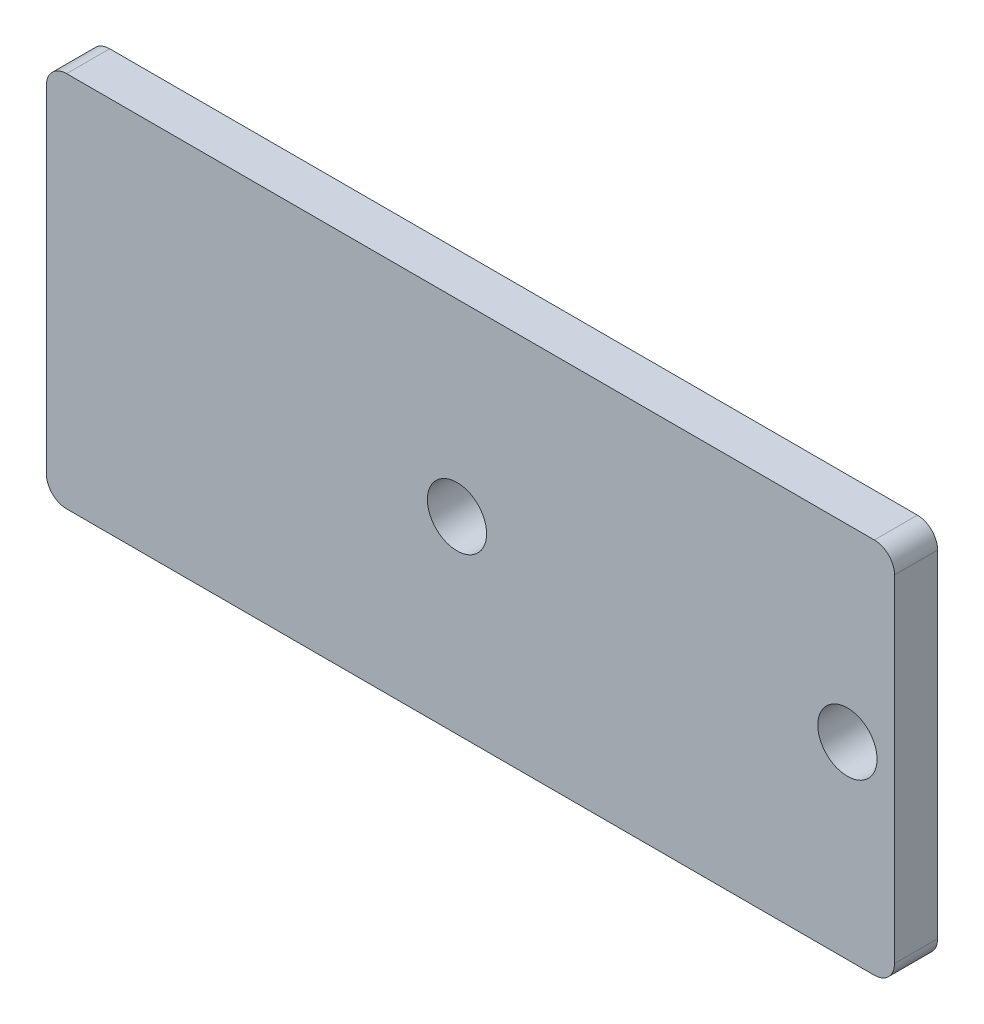
ISO-10303-21;
HEADER;
FILE_DESCRIPTION(('STEP AP214'),'2;1');
FILE_NAME('part.step','',(''),(''),'','','');
FILE_SCHEMA(('AUTOMOTIVE_DESIGN { 1 0 10303 214 1 1 1 1 }'));
ENDSEC;
DATA;
#1=APPLICATION_CONTEXT('core data for automotive mechanical design processes');
#2=APPLICATION_PROTOCOL_DEFINITION('international standard','automotive_design',2000,#1);
#3=PRODUCT_CONTEXT('',#1,'mechanical');
#4=PRODUCT('Part','Part','',(#3));
#5=PRODUCT_RELATED_PRODUCT_CATEGORY('part','',(#4));
#6=PRODUCT_DEFINITION_FORMATION('','',#4);
#7=PRODUCT_DEFINITION_CONTEXT('part definition',#1,'design');
#8=PRODUCT_DEFINITION('design','',#6,#7);
#9=PRODUCT_DEFINITION_SHAPE('','',#8);
#10=(LENGTH_UNIT() NAMED_UNIT(*) SI_UNIT(.MILLI.,.METRE.));
#11=(NAMED_UNIT(*) PLANE_ANGLE_UNIT() SI_UNIT($,.RADIAN.));
#12=(NAMED_UNIT(*) SI_UNIT($,.STERADIAN.) SOLID_ANGLE_UNIT());
#13=UNCERTAINTY_MEASURE_WITH_UNIT(LENGTH_MEASURE(1.E-05),#10,'distance_accuracy_value','');
#14=(GEOMETRIC_REPRESENTATION_CONTEXT(3) GLOBAL_UNCERTAINTY_ASSIGNED_CONTEXT((#13)) GLOBAL_UNIT_ASSIGNED_CONTEXT((#10,
#11,#12)) REPRESENTATION_CONTEXT('',''));
#15=CARTESIAN_POINT('',(0.,0.,0.));
#16=DIRECTION('',(0.,0.,1.));
#17=DIRECTION('',(1.,0.,0.));
#18=AXIS2_PLACEMENT_3D('',#15,#16,#17);
#19=CARTESIAN_POINT('',(15.,6.25,0.8));
#20=DIRECTION('',(0.,0.,1.));
#21=DIRECTION('',(1.,0.,0.));
#22=AXIS2_PLACEMENT_3D('',#19,#20,#21);
#23=PLANE('',#22);
#24=CARTESIAN_POINT('',(-0.499999999999999,0.,0.8));
#25=DIRECTION('',(0.,0.,1.));
#26=DIRECTION('',(1.,0.,0.));
#27=AXIS2_PLACEMENT_3D('',#24,#25,#26);
#28=CIRCLE('',#27,1.1);
#29=CARTESIAN_POINT('',(0.600000000000001,0.,0.8));
#30=VERTEX_POINT('',#29);
#31=EDGE_CURVE('E136',#30,#30,#28,.T.);
#32=ORIENTED_EDGE('',*,*,#31,.F.);
#33=EDGE_LOOP('',(#32));
#34=FACE_BOUND('',#33,.T.);
#35=CARTESIAN_POINT('',(15.,6.25,0.8));
#36=DIRECTION('',(0.,0.,1.));
#37=DIRECTION('',(1.,0.,0.));
#38=AXIS2_PLACEMENT_3D('',#35,#36,#37);
#39=CIRCLE('',#38,0.750000000000003);
#40=CARTESIAN_POINT('',(15.75,6.25,0.8));
#41=VERTEX_POINT('',#40);
#42=CARTESIAN_POINT('',(15.,7.,0.8));
#43=VERTEX_POINT('',#42);
#44=EDGE_CURVE('E147',#41,#43,#39,.T.);
#45=ORIENTED_EDGE('',*,*,#44,.T.);
#46=DIRECTION('',(-1.,0.,0.));
#47=VECTOR('',#46,1.);
#48=CARTESIAN_POINT('',(15.,7.,0.8));
#49=LINE('',#48,#47);
#50=CARTESIAN_POINT('',(-15.,7.,0.8));
#51=VERTEX_POINT('',#50);
#52=EDGE_CURVE('E95',#43,#51,#49,.T.);
#53=ORIENTED_EDGE('',*,*,#52,.T.);
#54=CARTESIAN_POINT('',(-15.,6.25,0.8));
#55=DIRECTION('',(0.,0.,1.));
#56=DIRECTION('',(1.,0.,0.));
#57=AXIS2_PLACEMENT_3D('',#54,#55,#56);
#58=CIRCLE('',#57,0.750000000000003);
#59=CARTESIAN_POINT('',(-15.75,6.25,0.8));
#60=VERTEX_POINT('',#59);
#61=EDGE_CURVE('E162',#51,#60,#58,.T.);
#62=ORIENTED_EDGE('',*,*,#61,.T.);
#63=DIRECTION('',(0.,-1.,0.));
#64=VECTOR('',#63,1.);
#65=CARTESIAN_POINT('',(-15.75,6.25,0.8));
#66=LINE('',#65,#64);
#67=CARTESIAN_POINT('',(-15.75,-6.25,0.8));
#68=VERTEX_POINT('',#67);
#69=EDGE_CURVE('E175',#60,#68,#66,.T.);
#70=ORIENTED_EDGE('',*,*,#69,.T.);
#71=CARTESIAN_POINT('',(-15.,-6.25,0.8));
#72=DIRECTION('',(0.,0.,1.));
#73=DIRECTION('',(1.,0.,0.));
#74=AXIS2_PLACEMENT_3D('',#71,#72,#73);
#75=CIRCLE('',#74,0.75);
#76=CARTESIAN_POINT('',(-15.,-7.,0.8));
#77=VERTEX_POINT('',#76);
#78=EDGE_CURVE('E114',#68,#77,#75,.T.);
#79=ORIENTED_EDGE('',*,*,#78,.T.);
#80=DIRECTION('',(1.,0.,0.));
#81=VECTOR('',#80,1.);
#82=CARTESIAN_POINT('',(-15.,-7.,0.8));
#83=LINE('',#82,#81);
#84=CARTESIAN_POINT('',(15.,-7.,0.8));
#85=VERTEX_POINT('',#84);
#86=EDGE_CURVE('E108',#77,#85,#83,.T.);
#87=ORIENTED_EDGE('',*,*,#86,.T.);
#88=CARTESIAN_POINT('',(15.,-6.25,0.8));
#89=DIRECTION('',(0.,0.,1.));
#90=DIRECTION('',(1.,0.,0.));
#91=AXIS2_PLACEMENT_3D('',#88,#89,#90);
#92=CIRCLE('',#91,0.750000000000004);
#93=CARTESIAN_POINT('',(15.75,-6.25,0.8));
#94=VERTEX_POINT('',#93);
#95=EDGE_CURVE('E112',#85,#94,#92,.T.);
#96=ORIENTED_EDGE('',*,*,#95,.T.);
#97=DIRECTION('',(0.,1.,0.));
#98=VECTOR('',#97,1.);
#99=CARTESIAN_POINT('',(15.75,-6.25,0.8));
#100=LINE('',#99,#98);
#101=EDGE_CURVE('E52',#94,#41,#100,.T.);
#102=ORIENTED_EDGE('',*,*,#101,.T.);
#103=EDGE_LOOP('',(#45,#53,#62,#70,#79,#87,#96,#102));
#104=FACE_BOUND('',#103,.T.);
#105=CARTESIAN_POINT('',(14.,0.,0.8));
#106=DIRECTION('',(0.,0.,1.));
#107=DIRECTION('',(1.,0.,0.));
#108=AXIS2_PLACEMENT_3D('',#105,#106,#107);
#109=CIRCLE('',#108,1.1);
#110=CARTESIAN_POINT('',(15.1,0.,0.8));
#111=VERTEX_POINT('',#110);
#112=EDGE_CURVE('E184',#111,#111,#109,.T.);
#113=ORIENTED_EDGE('',*,*,#112,.F.);
#114=EDGE_LOOP('',(#113));
#115=FACE_BOUND('',#114,.T.);
#116=ADVANCED_FACE('F35',(#34,#104,#115),#23,.T.);
#117=CARTESIAN_POINT('',(15.,6.25,-0.8));
#118=DIRECTION('',(0.,0.,1.));
#119=DIRECTION('',(1.,0.,0.));
#120=AXIS2_PLACEMENT_3D('',#117,#118,#119);
#121=PLANE('',#120);
#122=CARTESIAN_POINT('',(15.,6.25,-0.8));
#123=DIRECTION('',(0.,0.,1.));
#124=DIRECTION('',(1.,0.,0.));
#125=AXIS2_PLACEMENT_3D('',#122,#123,#124);
#126=CIRCLE('',#125,0.750000000000003);
#127=CARTESIAN_POINT('',(15.75,6.25,-0.8));
#128=VERTEX_POINT('',#127);
#129=CARTESIAN_POINT('',(15.,7.,-0.8));
#130=VERTEX_POINT('',#129);
#131=EDGE_CURVE('E132',#128,#130,#126,.T.);
#132=ORIENTED_EDGE('',*,*,#131,.F.);
#133=DIRECTION('',(0.,1.,0.));
#134=VECTOR('',#133,1.);
#135=CARTESIAN_POINT('',(15.75,-6.25,-0.8));
#136=LINE('',#135,#134);
#137=CARTESIAN_POINT('',(15.75,-6.25,-0.8));
#138=VERTEX_POINT('',#137);
#139=EDGE_CURVE('E87',#138,#128,#136,.T.);
#140=ORIENTED_EDGE('',*,*,#139,.F.);
#141=CARTESIAN_POINT('',(15.,-6.25,-0.8));
#142=DIRECTION('',(0.,0.,1.));
#143=DIRECTION('',(1.,0.,0.));
#144=AXIS2_PLACEMENT_3D('',#141,#142,#143);
#145=CIRCLE('',#144,0.750000000000004);
#146=CARTESIAN_POINT('',(15.,-7.,-0.8));
#147=VERTEX_POINT('',#146);
#148=EDGE_CURVE('E81',#147,#138,#145,.T.);
#149=ORIENTED_EDGE('',*,*,#148,.F.);
#150=DIRECTION('',(1.,0.,0.));
#151=VECTOR('',#150,1.);
#152=CARTESIAN_POINT('',(-15.,-7.,-0.8));
#153=LINE('',#152,#151);
#154=CARTESIAN_POINT('',(-15.,-7.,-0.8));
#155=VERTEX_POINT('',#154);
#156=EDGE_CURVE('E122',#155,#147,#153,.T.);
#157=ORIENTED_EDGE('',*,*,#156,.F.);
#158=CARTESIAN_POINT('',(-15.,-6.25,-0.8));
#159=DIRECTION('',(0.,0.,1.));
#160=DIRECTION('',(1.,0.,0.));
#161=AXIS2_PLACEMENT_3D('',#158,#159,#160);
#162=CIRCLE('',#161,0.75);
#163=CARTESIAN_POINT('',(-15.75,-6.25,-0.8));
#164=VERTEX_POINT('',#163);
#165=EDGE_CURVE('E142',#164,#155,#162,.T.);
#166=ORIENTED_EDGE('',*,*,#165,.F.);
#167=DIRECTION('',(0.,-1.,0.));
#168=VECTOR('',#167,1.);
#169=CARTESIAN_POINT('',(-15.75,6.25,-0.8));
#170=LINE('',#169,#168);
#171=CARTESIAN_POINT('',(-15.75,6.25,-0.8));
#172=VERTEX_POINT('',#171);
#173=EDGE_CURVE('E140',#172,#164,#170,.T.);
#174=ORIENTED_EDGE('',*,*,#173,.F.);
#175=CARTESIAN_POINT('',(-15.,6.25,-0.8));
#176=DIRECTION('',(0.,0.,1.));
#177=DIRECTION('',(1.,0.,0.));
#178=AXIS2_PLACEMENT_3D('',#175,#176,#177);
#179=CIRCLE('',#178,0.750000000000003);
#180=CARTESIAN_POINT('',(-15.,7.,-0.8));
#181=VERTEX_POINT('',#180);
#182=EDGE_CURVE('E138',#181,#172,#179,.T.);
#183=ORIENTED_EDGE('',*,*,#182,.F.);
#184=DIRECTION('',(-1.,0.,0.));
#185=VECTOR('',#184,1.);
#186=CARTESIAN_POINT('',(15.,7.,-0.8));
#187=LINE('',#186,#185);
#188=EDGE_CURVE('E135',#130,#181,#187,.T.);
#189=ORIENTED_EDGE('',*,*,#188,.F.);
#190=EDGE_LOOP('',(#132,#140,#149,#157,#166,#174,#183,#189));
#191=FACE_BOUND('',#190,.T.);
#192=CARTESIAN_POINT('',(-0.499999999999999,0.,-0.8));
#193=DIRECTION('',(0.,0.,1.));
#194=DIRECTION('',(1.,0.,0.));
#195=AXIS2_PLACEMENT_3D('',#192,#193,#194);
#196=CIRCLE('',#195,1.1);
#197=CARTESIAN_POINT('',(0.600000000000001,0.,-0.8));
#198=VERTEX_POINT('',#197);
#199=EDGE_CURVE('E181',#198,#198,#196,.T.);
#200=ORIENTED_EDGE('',*,*,#199,.T.);
#201=EDGE_LOOP('',(#200));
#202=FACE_BOUND('',#201,.T.);
#203=CARTESIAN_POINT('',(14.,0.,-0.8));
#204=DIRECTION('',(0.,0.,1.));
#205=DIRECTION('',(1.,0.,0.));
#206=AXIS2_PLACEMENT_3D('',#203,#204,#205);
#207=CIRCLE('',#206,1.1);
#208=CARTESIAN_POINT('',(15.1,0.,-0.8));
#209=VERTEX_POINT('',#208);
#210=EDGE_CURVE('E187',#209,#209,#207,.T.);
#211=ORIENTED_EDGE('',*,*,#210,.T.);
#212=EDGE_LOOP('',(#211));
#213=FACE_BOUND('',#212,.T.);
#214=ADVANCED_FACE('F166',(#191,#202,#213),#121,.F.);
#215=CARTESIAN_POINT('',(15.,6.25,0.8));
#216=DIRECTION('',(0.,0.,-1.));
#217=DIRECTION('',(-1.,0.,0.));
#218=AXIS2_PLACEMENT_3D('',#215,#216,#217);
#219=CYLINDRICAL_SURFACE('',#218,0.750000000000003);
#220=ORIENTED_EDGE('',*,*,#131,.T.);
#221=DIRECTION('',(0.,0.,-1.));
#222=VECTOR('',#221,1.);
#223=CARTESIAN_POINT('',(15.,7.,0.8));
#224=LINE('',#223,#222);
#225=EDGE_CURVE('E11',#43,#130,#224,.T.);
#226=ORIENTED_EDGE('',*,*,#225,.F.);
#227=ORIENTED_EDGE('',*,*,#44,.F.);
#228=DIRECTION('',(0.,0.,-1.));
#229=VECTOR('',#228,1.);
#230=CARTESIAN_POINT('',(15.75,6.25,0.8));
#231=LINE('',#230,#229);
#232=EDGE_CURVE('E128',#41,#128,#231,.T.);
#233=ORIENTED_EDGE('',*,*,#232,.T.);
#234=EDGE_LOOP('',(#220,#226,#227,#233));
#235=FACE_BOUND('',#234,.T.);
#236=ADVANCED_FACE('F37',(#235),#219,.T.);
#237=CARTESIAN_POINT('',(15.,7.,0.8));
#238=DIRECTION('',(0.,-1.,0.));
#239=DIRECTION('',(1.,0.,0.));
#240=AXIS2_PLACEMENT_3D('',#237,#238,#239);
#241=PLANE('',#240);
#242=ORIENTED_EDGE('',*,*,#188,.T.);
#243=DIRECTION('',(0.,0.,-1.));
#244=VECTOR('',#243,1.);
#245=CARTESIAN_POINT('',(-15.,7.,0.8));
#246=LINE('',#245,#244);
#247=EDGE_CURVE('E44',#51,#181,#246,.T.);
#248=ORIENTED_EDGE('',*,*,#247,.F.);
#249=ORIENTED_EDGE('',*,*,#52,.F.);
#250=ORIENTED_EDGE('',*,*,#225,.T.);
#251=EDGE_LOOP('',(#242,#248,#249,#250));
#252=FACE_BOUND('',#251,.T.);
#253=ADVANCED_FACE('F219',(#252),#241,.F.);
#254=CARTESIAN_POINT('',(-15.,6.25,0.8));
#255=DIRECTION('',(0.,0.,-1.));
#256=DIRECTION('',(-1.,0.,0.));
#257=AXIS2_PLACEMENT_3D('',#254,#255,#256);
#258=CYLINDRICAL_SURFACE('',#257,0.750000000000003);
#259=ORIENTED_EDGE('',*,*,#182,.T.);
#260=DIRECTION('',(0.,0.,-1.));
#261=VECTOR('',#260,1.);
#262=CARTESIAN_POINT('',(-15.75,6.25,0.8));
#263=LINE('',#262,#261);
#264=EDGE_CURVE('E154',#60,#172,#263,.T.);
#265=ORIENTED_EDGE('',*,*,#264,.F.);
#266=ORIENTED_EDGE('',*,*,#61,.F.);
#267=ORIENTED_EDGE('',*,*,#247,.T.);
#268=EDGE_LOOP('',(#259,#265,#266,#267));
#269=FACE_BOUND('',#268,.T.);
#270=ADVANCED_FACE('F160',(#269),#258,.T.);
#271=CARTESIAN_POINT('',(-15.75,6.25,0.8));
#272=DIRECTION('',(1.,0.,0.));
#273=DIRECTION('',(0.,1.,0.));
#274=AXIS2_PLACEMENT_3D('',#271,#272,#273);
#275=PLANE('',#274);
#276=ORIENTED_EDGE('',*,*,#173,.T.);
#277=DIRECTION('',(0.,0.,-1.));
#278=VECTOR('',#277,1.);
#279=CARTESIAN_POINT('',(-15.75,-6.25,0.8));
#280=LINE('',#279,#278);
#281=EDGE_CURVE('E151',#68,#164,#280,.T.);
#282=ORIENTED_EDGE('',*,*,#281,.F.);
#283=ORIENTED_EDGE('',*,*,#69,.F.);
#284=ORIENTED_EDGE('',*,*,#264,.T.);
#285=EDGE_LOOP('',(#276,#282,#283,#284));
#286=FACE_BOUND('',#285,.T.);
#287=ADVANCED_FACE('F171',(#286),#275,.F.);
#288=CARTESIAN_POINT('',(-15.,-6.25,0.8));
#289=DIRECTION('',(0.,0.,-1.));
#290=DIRECTION('',(-1.,0.,0.));
#291=AXIS2_PLACEMENT_3D('',#288,#289,#290);
#292=CYLINDRICAL_SURFACE('',#291,0.75);
#293=ORIENTED_EDGE('',*,*,#165,.T.);
#294=DIRECTION('',(0.,0.,-1.));
#295=VECTOR('',#294,1.);
#296=CARTESIAN_POINT('',(-15.,-7.,0.8));
#297=LINE('',#296,#295);
#298=EDGE_CURVE('E123',#77,#155,#297,.T.);
#299=ORIENTED_EDGE('',*,*,#298,.F.);
#300=ORIENTED_EDGE('',*,*,#78,.F.);
#301=ORIENTED_EDGE('',*,*,#281,.T.);
#302=EDGE_LOOP('',(#293,#299,#300,#301));
#303=FACE_BOUND('',#302,.T.);
#304=ADVANCED_FACE('F174',(#303),#292,.T.);
#305=CARTESIAN_POINT('',(-15.,-7.,0.8));
#306=DIRECTION('',(0.,1.,0.));
#307=DIRECTION('',(-1.,0.,0.));
#308=AXIS2_PLACEMENT_3D('',#305,#306,#307);
#309=PLANE('',#308);
#310=ORIENTED_EDGE('',*,*,#156,.T.);
#311=DIRECTION('',(0.,0.,-1.));
#312=VECTOR('',#311,1.);
#313=CARTESIAN_POINT('',(15.,-7.,0.8));
#314=LINE('',#313,#312);
#315=EDGE_CURVE('E119',#85,#147,#314,.T.);
#316=ORIENTED_EDGE('',*,*,#315,.F.);
#317=ORIENTED_EDGE('',*,*,#86,.F.);
#318=ORIENTED_EDGE('',*,*,#298,.T.);
#319=EDGE_LOOP('',(#310,#316,#317,#318));
#320=FACE_BOUND('',#319,.T.);
#321=ADVANCED_FACE('F120',(#320),#309,.F.);
#322=CARTESIAN_POINT('',(15.,-6.25,0.8));
#323=DIRECTION('',(0.,0.,-1.));
#324=DIRECTION('',(-1.,0.,0.));
#325=AXIS2_PLACEMENT_3D('',#322,#323,#324);
#326=CYLINDRICAL_SURFACE('',#325,0.750000000000004);
#327=ORIENTED_EDGE('',*,*,#148,.T.);
#328=DIRECTION('',(0.,0.,-1.));
#329=VECTOR('',#328,1.);
#330=CARTESIAN_POINT('',(15.75,-6.25,0.8));
#331=LINE('',#330,#329);
#332=EDGE_CURVE('E124',#94,#138,#331,.T.);
#333=ORIENTED_EDGE('',*,*,#332,.F.);
#334=ORIENTED_EDGE('',*,*,#95,.F.);
#335=ORIENTED_EDGE('',*,*,#315,.T.);
#336=EDGE_LOOP('',(#327,#333,#334,#335));
#337=FACE_BOUND('',#336,.T.);
#338=ADVANCED_FACE('F126',(#337),#326,.T.);
#339=CARTESIAN_POINT('',(15.75,-6.25,0.8));
#340=DIRECTION('',(-1.,0.,0.));
#341=DIRECTION('',(0.,-1.,0.));
#342=AXIS2_PLACEMENT_3D('',#339,#340,#341);
#343=PLANE('',#342);
#344=ORIENTED_EDGE('',*,*,#139,.T.);
#345=ORIENTED_EDGE('',*,*,#232,.F.);
#346=ORIENTED_EDGE('',*,*,#101,.F.);
#347=ORIENTED_EDGE('',*,*,#332,.T.);
#348=EDGE_LOOP('',(#344,#345,#346,#347));
#349=FACE_BOUND('',#348,.T.);
#350=ADVANCED_FACE('F207',(#349),#343,.F.);
#351=CARTESIAN_POINT('',(-0.499999999999999,0.,0.8));
#352=DIRECTION('',(0.,0.,-1.));
#353=DIRECTION('',(-1.,0.,0.));
#354=AXIS2_PLACEMENT_3D('',#351,#352,#353);
#355=CYLINDRICAL_SURFACE('',#354,1.1);
#356=ORIENTED_EDGE('',*,*,#31,.T.);
#357=EDGE_LOOP('',(#356));
#358=FACE_BOUND('',#357,.T.);
#359=ORIENTED_EDGE('',*,*,#199,.F.);
#360=EDGE_LOOP('',(#359));
#361=FACE_BOUND('',#360,.T.);
#362=ADVANCED_FACE('F204',(#358,#361),#355,.F.);
#363=CARTESIAN_POINT('',(14.,0.,0.8));
#364=DIRECTION('',(0.,0.,-1.));
#365=DIRECTION('',(-1.,0.,0.));
#366=AXIS2_PLACEMENT_3D('',#363,#364,#365);
#367=CYLINDRICAL_SURFACE('',#366,1.1);
#368=ORIENTED_EDGE('',*,*,#112,.T.);
#369=EDGE_LOOP('',(#368));
#370=FACE_BOUND('',#369,.T.);
#371=ORIENTED_EDGE('',*,*,#210,.F.);
#372=EDGE_LOOP('',(#371));
#373=FACE_BOUND('',#372,.T.);
#374=ADVANCED_FACE('F193',(#370,#373),#367,.F.);
#375=CLOSED_SHELL('',(#116,#214,#236,#253,#270,#287,#304,#321,#338,#350,#362,#374));
#376=MANIFOLD_SOLID_BREP('B2',#375);
#377=ADVANCED_BREP_SHAPE_REPRESENTATION('',(#18,#376),#14);
#378=SHAPE_DEFINITION_REPRESENTATION(#9,#377);
ENDSEC;
END-ISO-10303-21;
